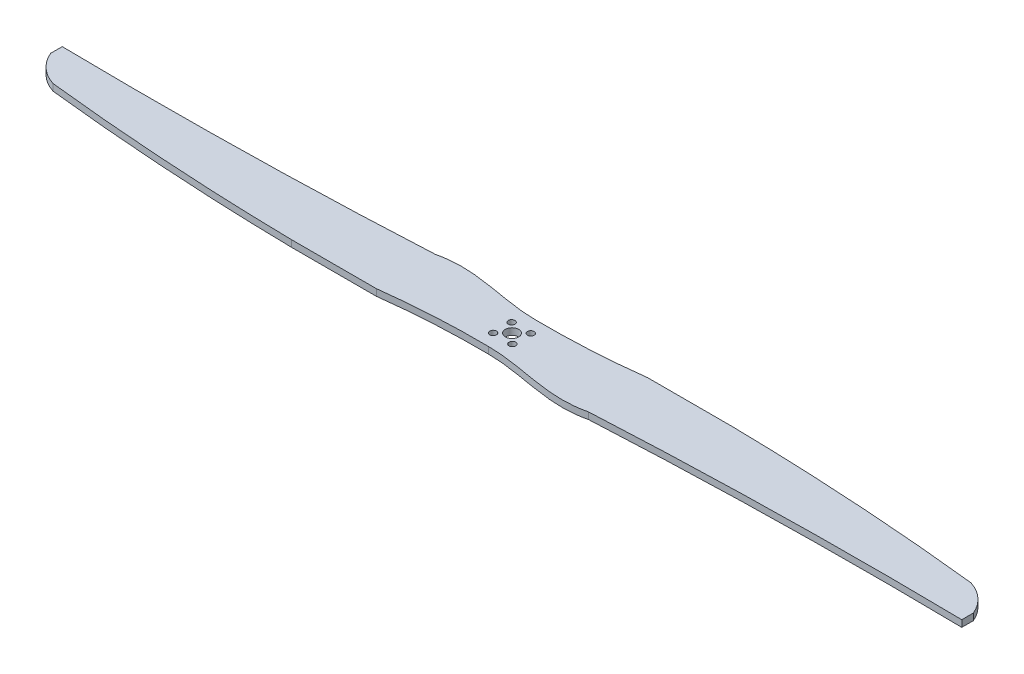
ISO-10303-21;
HEADER;
FILE_DESCRIPTION(('STEP AP214'),'2;1');
FILE_NAME('part.step','',(''),(''),'','','');
FILE_SCHEMA(('AUTOMOTIVE_DESIGN { 1 0 10303 214 1 1 1 1 }'));
ENDSEC;
DATA;
#1=APPLICATION_CONTEXT('core data for automotive mechanical design processes');
#2=APPLICATION_PROTOCOL_DEFINITION('international standard','automotive_design',2000,#1);
#3=PRODUCT_CONTEXT('',#1,'mechanical');
#4=PRODUCT('Part','Part','',(#3));
#5=PRODUCT_RELATED_PRODUCT_CATEGORY('part','',(#4));
#6=PRODUCT_DEFINITION_FORMATION('','',#4);
#7=PRODUCT_DEFINITION_CONTEXT('part definition',#1,'design');
#8=PRODUCT_DEFINITION('design','',#6,#7);
#9=PRODUCT_DEFINITION_SHAPE('','',#8);
#10=(LENGTH_UNIT() NAMED_UNIT(*) SI_UNIT(.MILLI.,.METRE.));
#11=(NAMED_UNIT(*) PLANE_ANGLE_UNIT() SI_UNIT($,.RADIAN.));
#12=(NAMED_UNIT(*) SI_UNIT($,.STERADIAN.) SOLID_ANGLE_UNIT());
#13=UNCERTAINTY_MEASURE_WITH_UNIT(LENGTH_MEASURE(1.E-05),#10,'distance_accuracy_value','');
#14=(GEOMETRIC_REPRESENTATION_CONTEXT(3) GLOBAL_UNCERTAINTY_ASSIGNED_CONTEXT((#13)) GLOBAL_UNIT_ASSIGNED_CONTEXT((#10,
#11,#12)) REPRESENTATION_CONTEXT('',''));
#15=CARTESIAN_POINT('',(0.,0.,0.));
#16=DIRECTION('',(0.,0.,1.));
#17=DIRECTION('',(1.,0.,0.));
#18=AXIS2_PLACEMENT_3D('',#15,#16,#17);
#19=CARTESIAN_POINT('',(335.,-2.5,-10.));
#20=CARTESIAN_POINT('',(207.750610825478,-2.5,-23.9960746393306));
#21=CARTESIAN_POINT('',(80.,-2.5,-22.));
#22=B_SPLINE_CURVE_WITH_KNOTS('',2,(#19,#20,#21),.UNSPECIFIED.,.F.,.F.,(3,3),(0.,1.),.UNSPECIFIED.);
#23=DIRECTION('',(0.,1.,0.));
#24=VECTOR('',#23,1.);
#25=SURFACE_OF_LINEAR_EXTRUSION('',#22,#24);
#26=DIRECTION('',(0.,1.,0.));
#27=VECTOR('',#26,1.);
#28=CARTESIAN_POINT('',(143.749999999999,-2.5,-22.));
#29=LINE('',#28,#27);
#30=CARTESIAN_POINT('',(143.749999999999,-2.5,-22.));
#31=VERTEX_POINT('',#30);
#32=CARTESIAN_POINT('',(143.749999999999,2.5,-22.));
#33=VERTEX_POINT('',#32);
#34=EDGE_CURVE('E40',#31,#33,#29,.T.);
#35=ORIENTED_EDGE('',*,*,#34,.T.);
#36=CARTESIAN_POINT('',(335.,2.5,-10.));
#37=CARTESIAN_POINT('',(207.750610825478,2.5,-23.9960746393306));
#38=CARTESIAN_POINT('',(80.,2.5,-22.));
#39=B_SPLINE_CURVE_WITH_KNOTS('',2,(#36,#37,#38),.UNSPECIFIED.,.F.,.F.,(3,3),(0.,1.),.UNSPECIFIED.);
#40=CARTESIAN_POINT('',(335.,2.5,-10.));
#41=VERTEX_POINT('',#40);
#42=EDGE_CURVE('E283',#41,#33,#39,.T.);
#43=ORIENTED_EDGE('',*,*,#42,.F.);
#44=DIRECTION('',(0.,1.,0.));
#45=VECTOR('',#44,1.);
#46=CARTESIAN_POINT('',(335.,-2.5,-10.));
#47=LINE('',#46,#45);
#48=CARTESIAN_POINT('',(335.,-2.5,-10.));
#49=VERTEX_POINT('',#48);
#50=EDGE_CURVE('E11',#49,#41,#47,.T.);
#51=ORIENTED_EDGE('',*,*,#50,.F.);
#52=EDGE_CURVE('E284',#49,#31,#22,.T.);
#53=ORIENTED_EDGE('',*,*,#52,.T.);
#54=EDGE_LOOP('',(#35,#43,#51,#53));
#55=FACE_BOUND('',#54,.T.);
#56=ADVANCED_FACE('F36',(#55),#25,.T.);
#57=CARTESIAN_POINT('',(325.075714008156,-2.5,21.5947488763719));
#58=DIRECTION('',(0.,1.,0.));
#59=DIRECTION('',(0.,0.,1.));
#60=AXIS2_PLACEMENT_3D('',#57,#58,#59);
#61=CYLINDRICAL_SURFACE('',#60,33.1167572236309);
#62=ORIENTED_EDGE('',*,*,#50,.T.);
#63=CARTESIAN_POINT('',(325.075714008156,2.5,21.5947488763719));
#64=DIRECTION('',(0.,1.,0.));
#65=DIRECTION('',(0.,0.,1.));
#66=AXIS2_PLACEMENT_3D('',#63,#64,#65);
#67=CIRCLE('',#66,33.1167572236309);
#68=CARTESIAN_POINT('',(355.6,2.5,8.75000000000002));
#69=VERTEX_POINT('',#68);
#70=EDGE_CURVE('E292',#69,#41,#67,.T.);
#71=ORIENTED_EDGE('',*,*,#70,.F.);
#72=DIRECTION('',(0.,1.,0.));
#73=VECTOR('',#72,1.);
#74=CARTESIAN_POINT('',(355.6,-2.5,8.75000000000002));
#75=LINE('',#74,#73);
#76=CARTESIAN_POINT('',(355.6,-2.5,8.75000000000002));
#77=VERTEX_POINT('',#76);
#78=EDGE_CURVE('E45',#77,#69,#75,.T.);
#79=ORIENTED_EDGE('',*,*,#78,.F.);
#80=CARTESIAN_POINT('',(325.075714008156,-2.5,21.5947488763719));
#81=DIRECTION('',(0.,1.,0.));
#82=DIRECTION('',(0.,0.,1.));
#83=AXIS2_PLACEMENT_3D('',#80,#81,#82);
#84=CIRCLE('',#83,33.1167572236309);
#85=EDGE_CURVE('E259',#77,#49,#84,.T.);
#86=ORIENTED_EDGE('',*,*,#85,.T.);
#87=EDGE_LOOP('',(#62,#71,#79,#86));
#88=FACE_BOUND('',#87,.T.);
#89=ADVANCED_FACE('F224',(#88),#61,.T.);
#90=CARTESIAN_POINT('',(355.6,-2.5,0.));
#91=DIRECTION('',(-1.,0.,0.));
#92=DIRECTION('',(0.,0.,1.));
#93=AXIS2_PLACEMENT_3D('',#90,#91,#92);
#94=PLANE('',#93);
#95=ORIENTED_EDGE('',*,*,#78,.T.);
#96=DIRECTION('',(0.,0.,1.));
#97=VECTOR('',#96,1.);
#98=CARTESIAN_POINT('',(355.6,2.5,0.));
#99=LINE('',#98,#97);
#100=CARTESIAN_POINT('',(355.6,2.5,17.5));
#101=VERTEX_POINT('',#100);
#102=EDGE_CURVE('E319',#69,#101,#99,.T.);
#103=ORIENTED_EDGE('',*,*,#102,.T.);
#104=DIRECTION('',(0.,1.,0.));
#105=VECTOR('',#104,1.);
#106=CARTESIAN_POINT('',(355.6,-2.5,17.5));
#107=LINE('',#106,#105);
#108=CARTESIAN_POINT('',(355.6,-2.5,17.5));
#109=VERTEX_POINT('',#108);
#110=EDGE_CURVE('E268',#109,#101,#107,.T.);
#111=ORIENTED_EDGE('',*,*,#110,.F.);
#112=DIRECTION('',(0.,0.,1.));
#113=VECTOR('',#112,1.);
#114=CARTESIAN_POINT('',(355.6,-2.5,0.));
#115=LINE('',#114,#113);
#116=EDGE_CURVE('E257',#77,#109,#115,.T.);
#117=ORIENTED_EDGE('',*,*,#116,.F.);
#118=EDGE_LOOP('',(#95,#103,#111,#117));
#119=FACE_BOUND('',#118,.T.);
#120=ADVANCED_FACE('F227',(#119),#94,.F.);
#121=CARTESIAN_POINT('',(289.29232916411,-2.5,3960.65718352576));
#122=DIRECTION('',(0.,1.,0.));
#123=DIRECTION('',(0.,0.,1.));
#124=AXIS2_PLACEMENT_3D('',#121,#122,#123);
#125=CYLINDRICAL_SURFACE('',#124,3943.71465514462);
#126=ORIENTED_EDGE('',*,*,#110,.T.);
#127=CARTESIAN_POINT('',(289.29232916411,2.5,3960.65718352576));
#128=DIRECTION('',(0.,1.,0.));
#129=DIRECTION('',(0.,0.,1.));
#130=AXIS2_PLACEMENT_3D('',#127,#128,#129);
#131=CIRCLE('',#130,3943.71465514462);
#132=CARTESIAN_POINT('',(79.9999999999992,2.5,22.5000000000004));
#133=VERTEX_POINT('',#132);
#134=EDGE_CURVE('E313',#133,#101,#131,.F.);
#135=ORIENTED_EDGE('',*,*,#134,.F.);
#136=DIRECTION('',(0.,1.,0.));
#137=VECTOR('',#136,1.);
#138=CARTESIAN_POINT('',(79.9999999999992,-2.5,22.5000000000004));
#139=LINE('',#138,#137);
#140=CARTESIAN_POINT('',(79.9999999999992,-2.5,22.5000000000004));
#141=VERTEX_POINT('',#140);
#142=EDGE_CURVE('E270',#141,#133,#139,.T.);
#143=ORIENTED_EDGE('',*,*,#142,.F.);
#144=CARTESIAN_POINT('',(289.29232916411,-2.5,3960.65718352576));
#145=DIRECTION('',(0.,1.,0.));
#146=DIRECTION('',(0.,0.,1.));
#147=AXIS2_PLACEMENT_3D('',#144,#145,#146);
#148=CIRCLE('',#147,3943.71465514462);
#149=EDGE_CURVE('E249',#141,#109,#148,.F.);
#150=ORIENTED_EDGE('',*,*,#149,.T.);
#151=EDGE_LOOP('',(#126,#135,#143,#150));
#152=FACE_BOUND('',#151,.T.);
#153=ADVANCED_FACE('F230',(#152),#125,.F.);
#154=CARTESIAN_POINT('',(0.,-2.5,17.5));
#155=CARTESIAN_POINT('',(26.9441187382483,-2.5,17.5325819704456));
#156=CARTESIAN_POINT('',(52.6196628030616,-2.5,29.0659508435102));
#157=CARTESIAN_POINT('',(80.,-2.5,22.5));
#158=B_SPLINE_CURVE_WITH_KNOTS('',3,(#154,#155,#156,#157),.UNSPECIFIED.,.F.,.F.,(4,4),(0.,1.),.UNSPECIFIED.);
#159=DIRECTION('',(0.,1.,0.));
#160=VECTOR('',#159,1.);
#161=SURFACE_OF_LINEAR_EXTRUSION('',#158,#160);
#162=ORIENTED_EDGE('',*,*,#142,.T.);
#163=CARTESIAN_POINT('',(0.,2.5,17.5));
#164=CARTESIAN_POINT('',(26.9441187382483,2.5,17.5325819704456));
#165=CARTESIAN_POINT('',(52.6196628030616,2.5,29.0659508435102));
#166=CARTESIAN_POINT('',(80.,2.5,22.5));
#167=B_SPLINE_CURVE_WITH_KNOTS('',3,(#163,#164,#165,#166),.UNSPECIFIED.,.F.,.F.,(4,4),(0.,1.),.UNSPECIFIED.);
#168=CARTESIAN_POINT('',(0.,2.5,17.5));
#169=VERTEX_POINT('',#168);
#170=EDGE_CURVE('E308',#169,#133,#167,.T.);
#171=ORIENTED_EDGE('',*,*,#170,.F.);
#172=DIRECTION('',(0.,1.,0.));
#173=VECTOR('',#172,1.);
#174=CARTESIAN_POINT('',(0.,-2.5,17.5));
#175=LINE('',#174,#173);
#176=CARTESIAN_POINT('',(0.,-2.5,17.5));
#177=VERTEX_POINT('',#176);
#178=EDGE_CURVE('E272',#177,#169,#175,.T.);
#179=ORIENTED_EDGE('',*,*,#178,.F.);
#180=EDGE_CURVE('E242',#177,#141,#158,.T.);
#181=ORIENTED_EDGE('',*,*,#180,.T.);
#182=EDGE_LOOP('',(#162,#171,#179,#181));
#183=FACE_BOUND('',#182,.T.);
#184=ADVANCED_FACE('F234',(#183),#161,.T.);
#185=CARTESIAN_POINT('',(0.,-2.5,0.));
#186=DIRECTION('',(0.,1.,0.));
#187=DIRECTION('',(0.,0.,1.));
#188=AXIS2_PLACEMENT_3D('',#185,#186,#187);
#189=CYLINDRICAL_SURFACE('',#188,5.);
#190=CARTESIAN_POINT('',(0.,2.5,0.));
#191=DIRECTION('',(0.,1.,0.));
#192=DIRECTION('',(0.,0.,1.));
#193=AXIS2_PLACEMENT_3D('',#190,#191,#192);
#194=CIRCLE('',#193,5.);
#195=CARTESIAN_POINT('',(0.,2.5,5.));
#196=VERTEX_POINT('',#195);
#197=EDGE_CURVE('E305',#196,#196,#194,.T.);
#198=ORIENTED_EDGE('',*,*,#197,.T.);
#199=EDGE_LOOP('',(#198));
#200=FACE_BOUND('',#199,.T.);
#201=CARTESIAN_POINT('',(0.,-2.5,0.));
#202=DIRECTION('',(0.,1.,0.));
#203=DIRECTION('',(0.,0.,1.));
#204=AXIS2_PLACEMENT_3D('',#201,#202,#203);
#205=CIRCLE('',#204,5.);
#206=CARTESIAN_POINT('',(0.,-2.5,5.));
#207=VERTEX_POINT('',#206);
#208=EDGE_CURVE('E250',#207,#207,#205,.T.);
#209=ORIENTED_EDGE('',*,*,#208,.F.);
#210=EDGE_LOOP('',(#209));
#211=FACE_BOUND('',#210,.T.);
#212=ADVANCED_FACE('F239',(#200,#211),#189,.F.);
#213=CARTESIAN_POINT('',(7.20964400706171,-2.5,-602.689662096679));
#214=DIRECTION('',(0.,1.,0.));
#215=DIRECTION('',(0.,0.,1.));
#216=AXIS2_PLACEMENT_3D('',#213,#214,#215);
#217=CYLINDRICAL_SURFACE('',#216,585.234072480007);
#218=DIRECTION('',(0.,1.,0.));
#219=VECTOR('',#218,1.);
#220=CARTESIAN_POINT('',(0.,-2.5,-17.5));
#221=LINE('',#220,#219);
#222=CARTESIAN_POINT('',(0.,-2.5,-17.5));
#223=VERTEX_POINT('',#222);
#224=CARTESIAN_POINT('',(0.,2.5,-17.5));
#225=VERTEX_POINT('',#224);
#226=EDGE_CURVE('E275',#223,#225,#221,.T.);
#227=ORIENTED_EDGE('',*,*,#226,.T.);
#228=CARTESIAN_POINT('',(7.20964400706171,2.5,-602.689662096679));
#229=DIRECTION('',(0.,1.,0.));
#230=DIRECTION('',(0.,0.,1.));
#231=AXIS2_PLACEMENT_3D('',#228,#229,#230);
#232=CIRCLE('',#231,585.234072480007);
#233=CARTESIAN_POINT('',(80.,2.5,-22.));
#234=VERTEX_POINT('',#233);
#235=EDGE_CURVE('E288',#234,#225,#232,.F.);
#236=ORIENTED_EDGE('',*,*,#235,.F.);
#237=DIRECTION('',(0.,1.,0.));
#238=VECTOR('',#237,1.);
#239=CARTESIAN_POINT('',(80.,-2.5,-22.));
#240=LINE('',#239,#238);
#241=CARTESIAN_POINT('',(80.,-2.5,-22.));
#242=VERTEX_POINT('',#241);
#243=EDGE_CURVE('E277',#242,#234,#240,.T.);
#244=ORIENTED_EDGE('',*,*,#243,.F.);
#245=CARTESIAN_POINT('',(7.20964400706171,-2.5,-602.689662096679));
#246=DIRECTION('',(0.,1.,0.));
#247=DIRECTION('',(0.,0.,1.));
#248=AXIS2_PLACEMENT_3D('',#245,#246,#247);
#249=CIRCLE('',#248,585.234072480007);
#250=EDGE_CURVE('E336',#242,#223,#249,.F.);
#251=ORIENTED_EDGE('',*,*,#250,.T.);
#252=EDGE_LOOP('',(#227,#236,#244,#251));
#253=FACE_BOUND('',#252,.T.);
#254=ADVANCED_FACE('F222',(#253),#217,.F.);
#255=CARTESIAN_POINT('',(7.20964400706171,-2.5,6.92972101108257));
#256=DIRECTION('',(0.,1.,0.));
#257=DIRECTION('',(0.,0.,1.));
#258=AXIS2_PLACEMENT_3D('',#255,#256,#257);
#259=CYLINDRICAL_SURFACE('',#258,2.5);
#260=CARTESIAN_POINT('',(7.20964400706171,-2.5,6.92972101108257));
#261=DIRECTION('',(0.,1.,0.));
#262=DIRECTION('',(0.,0.,1.));
#263=AXIS2_PLACEMENT_3D('',#260,#261,#262);
#264=CIRCLE('',#263,2.5);
#265=CARTESIAN_POINT('',(7.20964400706171,-2.5,9.42972101108257));
#266=VERTEX_POINT('',#265);
#267=EDGE_CURVE('E261',#266,#266,#264,.T.);
#268=ORIENTED_EDGE('',*,*,#267,.F.);
#269=EDGE_LOOP('',(#268));
#270=FACE_BOUND('',#269,.T.);
#271=CARTESIAN_POINT('',(7.20964400706171,2.5,6.92972101108257));
#272=DIRECTION('',(0.,1.,0.));
#273=DIRECTION('',(0.,0.,1.));
#274=AXIS2_PLACEMENT_3D('',#271,#272,#273);
#275=CIRCLE('',#274,2.5);
#276=CARTESIAN_POINT('',(7.20964400706171,2.5,9.42972101108257));
#277=VERTEX_POINT('',#276);
#278=EDGE_CURVE('E323',#277,#277,#275,.T.);
#279=ORIENTED_EDGE('',*,*,#278,.T.);
#280=EDGE_LOOP('',(#279));
#281=FACE_BOUND('',#280,.T.);
#282=ADVANCED_FACE('F219',(#270,#281),#259,.F.);
#283=CARTESIAN_POINT('',(0.,-2.5,-22.));
#284=DIRECTION('',(0.,0.,-1.));
#285=DIRECTION('',(-1.,0.,0.));
#286=AXIS2_PLACEMENT_3D('',#283,#284,#285);
#287=PLANE('',#286);
#288=ORIENTED_EDGE('',*,*,#243,.T.);
#289=DIRECTION('',(-1.,0.,0.));
#290=VECTOR('',#289,1.);
#291=CARTESIAN_POINT('',(0.,2.5,-22.));
#292=LINE('',#291,#290);
#293=EDGE_CURVE('E286',#33,#234,#292,.T.);
#294=ORIENTED_EDGE('',*,*,#293,.F.);
#295=ORIENTED_EDGE('',*,*,#34,.F.);
#296=DIRECTION('',(-1.,0.,0.));
#297=VECTOR('',#296,1.);
#298=CARTESIAN_POINT('',(0.,-2.5,-22.));
#299=LINE('',#298,#297);
#300=EDGE_CURVE('E332',#31,#242,#299,.T.);
#301=ORIENTED_EDGE('',*,*,#300,.T.);
#302=EDGE_LOOP('',(#288,#294,#295,#301));
#303=FACE_BOUND('',#302,.T.);
#304=ADVANCED_FACE('F217',(#303),#287,.T.);
#305=CARTESIAN_POINT('',(7.20964400706171,-2.5,-6.92972101108257));
#306=DIRECTION('',(0.,1.,0.));
#307=DIRECTION('',(0.,0.,1.));
#308=AXIS2_PLACEMENT_3D('',#305,#306,#307);
#309=CYLINDRICAL_SURFACE('',#308,2.5);
#310=CARTESIAN_POINT('',(7.20964400706171,-2.5,-6.92972101108257));
#311=DIRECTION('',(0.,1.,0.));
#312=DIRECTION('',(0.,0.,1.));
#313=AXIS2_PLACEMENT_3D('',#310,#311,#312);
#314=CIRCLE('',#313,2.5);
#315=CARTESIAN_POINT('',(7.20964400706171,-2.5,-4.42972101108257));
#316=VERTEX_POINT('',#315);
#317=EDGE_CURVE('E264',#316,#316,#314,.T.);
#318=ORIENTED_EDGE('',*,*,#317,.F.);
#319=EDGE_LOOP('',(#318));
#320=FACE_BOUND('',#319,.T.);
#321=CARTESIAN_POINT('',(7.20964400706171,2.5,-6.92972101108257));
#322=DIRECTION('',(0.,1.,0.));
#323=DIRECTION('',(0.,0.,1.));
#324=AXIS2_PLACEMENT_3D('',#321,#322,#323);
#325=CIRCLE('',#324,2.5);
#326=CARTESIAN_POINT('',(7.20964400706171,2.5,-4.42972101108257));
#327=VERTEX_POINT('',#326);
#328=EDGE_CURVE('E326',#327,#327,#325,.T.);
#329=ORIENTED_EDGE('',*,*,#328,.T.);
#330=EDGE_LOOP('',(#329));
#331=FACE_BOUND('',#330,.T.);
#332=ADVANCED_FACE('F213',(#320,#331),#309,.F.);
#333=CARTESIAN_POINT('',(0.,-2.5,0.));
#334=DIRECTION('',(0.,1.,0.));
#335=DIRECTION('',(0.,0.,1.));
#336=AXIS2_PLACEMENT_3D('',#333,#334,#335);
#337=PLANE('',#336);
#338=CARTESIAN_POINT('',(0.,-2.5,-17.5));
#339=CARTESIAN_POINT('',(-26.9441187382483,-2.5,-17.5325819704456));
#340=CARTESIAN_POINT('',(-52.6196628030616,-2.5,-29.0659508435102));
#341=CARTESIAN_POINT('',(-80.,-2.5,-22.5));
#342=B_SPLINE_CURVE_WITH_KNOTS('',3,(#338,#339,#340,#341),.UNSPECIFIED.,.F.,.F.,(4,4),(0.,1.),.UNSPECIFIED.);
#343=CARTESIAN_POINT('',(-79.9999999999992,-2.5,-22.5000000000004));
#344=VERTEX_POINT('',#343);
#345=EDGE_CURVE('E491',#223,#344,#342,.T.);
#346=ORIENTED_EDGE('',*,*,#345,.F.);
#347=ORIENTED_EDGE('',*,*,#250,.F.);
#348=ORIENTED_EDGE('',*,*,#300,.F.);
#349=ORIENTED_EDGE('',*,*,#52,.F.);
#350=ORIENTED_EDGE('',*,*,#85,.F.);
#351=ORIENTED_EDGE('',*,*,#116,.T.);
#352=ORIENTED_EDGE('',*,*,#149,.F.);
#353=ORIENTED_EDGE('',*,*,#180,.F.);
#354=CARTESIAN_POINT('',(-7.20964400706171,-2.5,602.689662096679));
#355=DIRECTION('',(0.,1.,0.));
#356=DIRECTION('',(0.,0.,-1.));
#357=AXIS2_PLACEMENT_3D('',#354,#355,#356);
#358=CIRCLE('',#357,585.234072480007);
#359=CARTESIAN_POINT('',(-80.,-2.5,22.));
#360=VERTEX_POINT('',#359);
#361=EDGE_CURVE('E498',#360,#177,#358,.F.);
#362=ORIENTED_EDGE('',*,*,#361,.F.);
#363=DIRECTION('',(1.,0.,0.));
#364=VECTOR('',#363,1.);
#365=CARTESIAN_POINT('',(0.,-2.5,22.));
#366=LINE('',#365,#364);
#367=CARTESIAN_POINT('',(-143.749999999999,-2.5,22.));
#368=VERTEX_POINT('',#367);
#369=EDGE_CURVE('E197',#368,#360,#366,.T.);
#370=ORIENTED_EDGE('',*,*,#369,.F.);
#371=CARTESIAN_POINT('',(-335.,-2.5,10.));
#372=CARTESIAN_POINT('',(-207.750610825478,-2.5,23.9960746393306));
#373=CARTESIAN_POINT('',(-80.,-2.5,22.));
#374=B_SPLINE_CURVE_WITH_KNOTS('',2,(#371,#372,#373),.UNSPECIFIED.,.F.,.F.,(3,3),(0.,1.),.UNSPECIFIED.);
#375=CARTESIAN_POINT('',(-335.,-2.5,10.));
#376=VERTEX_POINT('',#375);
#377=EDGE_CURVE('E144',#376,#368,#374,.T.);
#378=ORIENTED_EDGE('',*,*,#377,.F.);
#379=CARTESIAN_POINT('',(-325.075714008156,-2.5,-21.5947488763719));
#380=DIRECTION('',(0.,1.,0.));
#381=DIRECTION('',(0.,0.,-1.));
#382=AXIS2_PLACEMENT_3D('',#379,#380,#381);
#383=CIRCLE('',#382,33.1167572236309);
#384=CARTESIAN_POINT('',(-355.6,-2.5,-8.75000000000002));
#385=VERTEX_POINT('',#384);
#386=EDGE_CURVE('E506',#385,#376,#383,.T.);
#387=ORIENTED_EDGE('',*,*,#386,.F.);
#388=DIRECTION('',(0.,0.,-1.));
#389=VECTOR('',#388,1.);
#390=CARTESIAN_POINT('',(-355.6,-2.5,0.));
#391=LINE('',#390,#389);
#392=CARTESIAN_POINT('',(-355.6,-2.5,-17.5));
#393=VERTEX_POINT('',#392);
#394=EDGE_CURVE('E504',#385,#393,#391,.T.);
#395=ORIENTED_EDGE('',*,*,#394,.T.);
#396=CARTESIAN_POINT('',(-289.29232916411,-2.5,-3960.65718352576));
#397=DIRECTION('',(0.,1.,0.));
#398=DIRECTION('',(0.,0.,-1.));
#399=AXIS2_PLACEMENT_3D('',#396,#397,#398);
#400=CIRCLE('',#399,3943.71465514462);
#401=EDGE_CURVE('E497',#344,#393,#400,.F.);
#402=ORIENTED_EDGE('',*,*,#401,.F.);
#403=EDGE_LOOP('',(#346,#347,#348,#349,#350,#351,#352,#353,#362,#370,#378,#387,#395,#402));
#404=FACE_BOUND('',#403,.T.);
#405=ORIENTED_EDGE('',*,*,#208,.T.);
#406=EDGE_LOOP('',(#405));
#407=FACE_BOUND('',#406,.T.);
#408=ORIENTED_EDGE('',*,*,#267,.T.);
#409=EDGE_LOOP('',(#408));
#410=FACE_BOUND('',#409,.T.);
#411=ORIENTED_EDGE('',*,*,#317,.T.);
#412=EDGE_LOOP('',(#411));
#413=FACE_BOUND('',#412,.T.);
#414=CARTESIAN_POINT('',(-7.20964400706171,-2.5,-6.92972101108257));
#415=DIRECTION('',(0.,1.,0.));
#416=DIRECTION('',(0.,0.,-1.));
#417=AXIS2_PLACEMENT_3D('',#414,#415,#416);
#418=CIRCLE('',#417,2.5);
#419=CARTESIAN_POINT('',(-7.20964400706171,-2.5,-9.42972101108257));
#420=VERTEX_POINT('',#419);
#421=EDGE_CURVE('E509',#420,#420,#418,.T.);
#422=ORIENTED_EDGE('',*,*,#421,.T.);
#423=EDGE_LOOP('',(#422));
#424=FACE_BOUND('',#423,.T.);
#425=CARTESIAN_POINT('',(-7.20964400706171,-2.5,6.92972101108257));
#426=DIRECTION('',(0.,1.,0.));
#427=DIRECTION('',(0.,0.,-1.));
#428=AXIS2_PLACEMENT_3D('',#425,#426,#427);
#429=CIRCLE('',#428,2.5);
#430=CARTESIAN_POINT('',(-7.20964400706171,-2.5,4.42972101108257));
#431=VERTEX_POINT('',#430);
#432=EDGE_CURVE('E149',#431,#431,#429,.T.);
#433=ORIENTED_EDGE('',*,*,#432,.T.);
#434=EDGE_LOOP('',(#433));
#435=FACE_BOUND('',#434,.T.);
#436=ADVANCED_FACE('F210',(#404,#407,#410,#413,#424,#435),#337,.F.);
#437=CARTESIAN_POINT('',(0.,2.5,0.));
#438=DIRECTION('',(0.,1.,0.));
#439=DIRECTION('',(0.,0.,1.));
#440=AXIS2_PLACEMENT_3D('',#437,#438,#439);
#441=PLANE('',#440);
#442=ORIENTED_EDGE('',*,*,#235,.T.);
#443=CARTESIAN_POINT('',(0.,2.5,-17.5));
#444=CARTESIAN_POINT('',(-26.9441187382483,2.5,-17.5325819704456));
#445=CARTESIAN_POINT('',(-52.6196628030616,2.5,-29.0659508435102));
#446=CARTESIAN_POINT('',(-80.,2.5,-22.5));
#447=B_SPLINE_CURVE_WITH_KNOTS('',3,(#443,#444,#445,#446),.UNSPECIFIED.,.F.,.F.,(4,4),(0.,1.),.UNSPECIFIED.);
#448=CARTESIAN_POINT('',(-79.9999999999992,2.5,-22.5000000000004));
#449=VERTEX_POINT('',#448);
#450=EDGE_CURVE('E172',#225,#449,#447,.T.);
#451=ORIENTED_EDGE('',*,*,#450,.T.);
#452=CARTESIAN_POINT('',(-289.29232916411,2.5,-3960.65718352576));
#453=DIRECTION('',(0.,1.,0.));
#454=DIRECTION('',(0.,0.,-1.));
#455=AXIS2_PLACEMENT_3D('',#452,#453,#454);
#456=CIRCLE('',#455,3943.71465514462);
#457=CARTESIAN_POINT('',(-355.6,2.5,-17.5));
#458=VERTEX_POINT('',#457);
#459=EDGE_CURVE('E177',#449,#458,#456,.F.);
#460=ORIENTED_EDGE('',*,*,#459,.T.);
#461=DIRECTION('',(0.,0.,-1.));
#462=VECTOR('',#461,1.);
#463=CARTESIAN_POINT('',(-355.6,2.5,0.));
#464=LINE('',#463,#462);
#465=CARTESIAN_POINT('',(-355.6,2.5,-8.75000000000002));
#466=VERTEX_POINT('',#465);
#467=EDGE_CURVE('E183',#466,#458,#464,.T.);
#468=ORIENTED_EDGE('',*,*,#467,.F.);
#469=CARTESIAN_POINT('',(-325.075714008156,2.5,-21.5947488763719));
#470=DIRECTION('',(0.,1.,0.));
#471=DIRECTION('',(0.,0.,-1.));
#472=AXIS2_PLACEMENT_3D('',#469,#470,#471);
#473=CIRCLE('',#472,33.1167572236309);
#474=CARTESIAN_POINT('',(-335.,2.5,10.));
#475=VERTEX_POINT('',#474);
#476=EDGE_CURVE('E163',#466,#475,#473,.T.);
#477=ORIENTED_EDGE('',*,*,#476,.T.);
#478=CARTESIAN_POINT('',(-335.,2.5,10.));
#479=CARTESIAN_POINT('',(-207.750610825478,2.5,23.9960746393306));
#480=CARTESIAN_POINT('',(-80.,2.5,22.));
#481=B_SPLINE_CURVE_WITH_KNOTS('',2,(#478,#479,#480),.UNSPECIFIED.,.F.,.F.,(3,3),(0.,1.),.UNSPECIFIED.);
#482=CARTESIAN_POINT('',(-143.749999999999,2.5,22.));
#483=VERTEX_POINT('',#482);
#484=EDGE_CURVE('E142',#475,#483,#481,.T.);
#485=ORIENTED_EDGE('',*,*,#484,.T.);
#486=DIRECTION('',(1.,0.,0.));
#487=VECTOR('',#486,1.);
#488=CARTESIAN_POINT('',(0.,2.5,22.));
#489=LINE('',#488,#487);
#490=CARTESIAN_POINT('',(-80.,2.5,22.));
#491=VERTEX_POINT('',#490);
#492=EDGE_CURVE('E152',#483,#491,#489,.T.);
#493=ORIENTED_EDGE('',*,*,#492,.T.);
#494=CARTESIAN_POINT('',(-7.20964400706171,2.5,602.689662096679));
#495=DIRECTION('',(0.,1.,0.));
#496=DIRECTION('',(0.,0.,-1.));
#497=AXIS2_PLACEMENT_3D('',#494,#495,#496);
#498=CIRCLE('',#497,585.234072480007);
#499=EDGE_CURVE('E156',#491,#169,#498,.F.);
#500=ORIENTED_EDGE('',*,*,#499,.T.);
#501=ORIENTED_EDGE('',*,*,#170,.T.);
#502=ORIENTED_EDGE('',*,*,#134,.T.);
#503=ORIENTED_EDGE('',*,*,#102,.F.);
#504=ORIENTED_EDGE('',*,*,#70,.T.);
#505=ORIENTED_EDGE('',*,*,#42,.T.);
#506=ORIENTED_EDGE('',*,*,#293,.T.);
#507=EDGE_LOOP('',(#442,#451,#460,#468,#477,#485,#493,#500,#501,#502,#503,#504,#505,#506));
#508=FACE_BOUND('',#507,.T.);
#509=ORIENTED_EDGE('',*,*,#197,.F.);
#510=EDGE_LOOP('',(#509));
#511=FACE_BOUND('',#510,.T.);
#512=ORIENTED_EDGE('',*,*,#278,.F.);
#513=EDGE_LOOP('',(#512));
#514=FACE_BOUND('',#513,.T.);
#515=ORIENTED_EDGE('',*,*,#328,.F.);
#516=EDGE_LOOP('',(#515));
#517=FACE_BOUND('',#516,.T.);
#518=CARTESIAN_POINT('',(-7.20964400706171,2.5,-6.92972101108257));
#519=DIRECTION('',(0.,1.,0.));
#520=DIRECTION('',(0.,0.,-1.));
#521=AXIS2_PLACEMENT_3D('',#518,#519,#520);
#522=CIRCLE('',#521,2.5);
#523=CARTESIAN_POINT('',(-7.20964400706171,2.5,-9.42972101108257));
#524=VERTEX_POINT('',#523);
#525=EDGE_CURVE('E187',#524,#524,#522,.T.);
#526=ORIENTED_EDGE('',*,*,#525,.F.);
#527=EDGE_LOOP('',(#526));
#528=FACE_BOUND('',#527,.T.);
#529=CARTESIAN_POINT('',(-7.20964400706171,2.5,6.92972101108257));
#530=DIRECTION('',(0.,1.,0.));
#531=DIRECTION('',(0.,0.,-1.));
#532=AXIS2_PLACEMENT_3D('',#529,#530,#531);
#533=CIRCLE('',#532,2.5);
#534=CARTESIAN_POINT('',(-7.20964400706171,2.5,4.42972101108257));
#535=VERTEX_POINT('',#534);
#536=EDGE_CURVE('E190',#535,#535,#533,.T.);
#537=ORIENTED_EDGE('',*,*,#536,.F.);
#538=EDGE_LOOP('',(#537));
#539=FACE_BOUND('',#538,.T.);
#540=ADVANCED_FACE('F159',(#508,#511,#514,#517,#528,#539),#441,.T.);
#541=DIRECTION('',(0.,1.,0.));
#542=VECTOR('',#541,1.);
#543=SURFACE_OF_LINEAR_EXTRUSION('',#374,#542);
#544=DIRECTION('',(0.,1.,0.));
#545=VECTOR('',#544,1.);
#546=CARTESIAN_POINT('',(-143.749999999999,-2.5,22.));
#547=LINE('',#546,#545);
#548=EDGE_CURVE('E138',#368,#483,#547,.T.);
#549=ORIENTED_EDGE('',*,*,#548,.T.);
#550=ORIENTED_EDGE('',*,*,#484,.F.);
#551=DIRECTION('',(0.,1.,0.));
#552=VECTOR('',#551,1.);
#553=CARTESIAN_POINT('',(-335.,-2.5,10.));
#554=LINE('',#553,#552);
#555=EDGE_CURVE('E293',#376,#475,#554,.T.);
#556=ORIENTED_EDGE('',*,*,#555,.F.);
#557=ORIENTED_EDGE('',*,*,#377,.T.);
#558=EDGE_LOOP('',(#549,#550,#556,#557));
#559=FACE_BOUND('',#558,.T.);
#560=ADVANCED_FACE('F140',(#559),#543,.T.);
#561=CARTESIAN_POINT('',(-325.075714008156,-2.5,-21.5947488763719));
#562=DIRECTION('',(0.,1.,0.));
#563=DIRECTION('',(0.,0.,1.));
#564=AXIS2_PLACEMENT_3D('',#561,#562,#563);
#565=CYLINDRICAL_SURFACE('',#564,33.1167572236309);
#566=ORIENTED_EDGE('',*,*,#555,.T.);
#567=ORIENTED_EDGE('',*,*,#476,.F.);
#568=DIRECTION('',(0.,1.,0.));
#569=VECTOR('',#568,1.);
#570=CARTESIAN_POINT('',(-355.6,-2.5,-8.75000000000002));
#571=LINE('',#570,#569);
#572=EDGE_CURVE('E295',#385,#466,#571,.T.);
#573=ORIENTED_EDGE('',*,*,#572,.F.);
#574=ORIENTED_EDGE('',*,*,#386,.T.);
#575=EDGE_LOOP('',(#566,#567,#573,#574));
#576=FACE_BOUND('',#575,.T.);
#577=ADVANCED_FACE('F206',(#576),#565,.T.);
#578=CARTESIAN_POINT('',(-355.6,-2.5,0.));
#579=DIRECTION('',(1.,0.,0.));
#580=DIRECTION('',(0.,0.,-1.));
#581=AXIS2_PLACEMENT_3D('',#578,#579,#580);
#582=PLANE('',#581);
#583=ORIENTED_EDGE('',*,*,#572,.T.);
#584=ORIENTED_EDGE('',*,*,#467,.T.);
#585=DIRECTION('',(0.,1.,0.));
#586=VECTOR('',#585,1.);
#587=CARTESIAN_POINT('',(-355.6,-2.5,-17.5));
#588=LINE('',#587,#586);
#589=EDGE_CURVE('E515',#393,#458,#588,.T.);
#590=ORIENTED_EDGE('',*,*,#589,.F.);
#591=ORIENTED_EDGE('',*,*,#394,.F.);
#592=EDGE_LOOP('',(#583,#584,#590,#591));
#593=FACE_BOUND('',#592,.T.);
#594=ADVANCED_FACE('F418',(#593),#582,.F.);
#595=CARTESIAN_POINT('',(-289.29232916411,-2.5,-3960.65718352576));
#596=DIRECTION('',(0.,1.,0.));
#597=DIRECTION('',(0.,0.,1.));
#598=AXIS2_PLACEMENT_3D('',#595,#596,#597);
#599=CYLINDRICAL_SURFACE('',#598,3943.71465514462);
#600=ORIENTED_EDGE('',*,*,#589,.T.);
#601=ORIENTED_EDGE('',*,*,#459,.F.);
#602=DIRECTION('',(0.,1.,0.));
#603=VECTOR('',#602,1.);
#604=CARTESIAN_POINT('',(-79.9999999999992,-2.5,-22.5000000000004));
#605=LINE('',#604,#603);
#606=EDGE_CURVE('E517',#344,#449,#605,.T.);
#607=ORIENTED_EDGE('',*,*,#606,.F.);
#608=ORIENTED_EDGE('',*,*,#401,.T.);
#609=EDGE_LOOP('',(#600,#601,#607,#608));
#610=FACE_BOUND('',#609,.T.);
#611=ADVANCED_FACE('F428',(#610),#599,.F.);
#612=DIRECTION('',(0.,1.,0.));
#613=VECTOR('',#612,1.);
#614=SURFACE_OF_LINEAR_EXTRUSION('',#342,#613);
#615=ORIENTED_EDGE('',*,*,#606,.T.);
#616=ORIENTED_EDGE('',*,*,#450,.F.);
#617=ORIENTED_EDGE('',*,*,#226,.F.);
#618=ORIENTED_EDGE('',*,*,#345,.T.);
#619=EDGE_LOOP('',(#615,#616,#617,#618));
#620=FACE_BOUND('',#619,.T.);
#621=ADVANCED_FACE('F438',(#620),#614,.T.);
#622=CARTESIAN_POINT('',(-7.20964400706171,-2.5,602.689662096679));
#623=DIRECTION('',(0.,1.,0.));
#624=DIRECTION('',(0.,0.,1.));
#625=AXIS2_PLACEMENT_3D('',#622,#623,#624);
#626=CYLINDRICAL_SURFACE('',#625,585.234072480007);
#627=ORIENTED_EDGE('',*,*,#178,.T.);
#628=ORIENTED_EDGE('',*,*,#499,.F.);
#629=DIRECTION('',(0.,1.,0.));
#630=VECTOR('',#629,1.);
#631=CARTESIAN_POINT('',(-80.,-2.5,22.));
#632=LINE('',#631,#630);
#633=EDGE_CURVE('E148',#360,#491,#632,.T.);
#634=ORIENTED_EDGE('',*,*,#633,.F.);
#635=ORIENTED_EDGE('',*,*,#361,.T.);
#636=EDGE_LOOP('',(#627,#628,#634,#635));
#637=FACE_BOUND('',#636,.T.);
#638=ADVANCED_FACE('F448',(#637),#626,.F.);
#639=CARTESIAN_POINT('',(-7.20964400706171,-2.5,-6.92972101108257));
#640=DIRECTION('',(0.,1.,0.));
#641=DIRECTION('',(0.,0.,1.));
#642=AXIS2_PLACEMENT_3D('',#639,#640,#641);
#643=CYLINDRICAL_SURFACE('',#642,2.5);
#644=ORIENTED_EDGE('',*,*,#421,.F.);
#645=EDGE_LOOP('',(#644));
#646=FACE_BOUND('',#645,.T.);
#647=ORIENTED_EDGE('',*,*,#525,.T.);
#648=EDGE_LOOP('',(#647));
#649=FACE_BOUND('',#648,.T.);
#650=ADVANCED_FACE('F458',(#646,#649),#643,.F.);
#651=CARTESIAN_POINT('',(0.,-2.5,22.));
#652=DIRECTION('',(0.,0.,1.));
#653=DIRECTION('',(1.,0.,0.));
#654=AXIS2_PLACEMENT_3D('',#651,#652,#653);
#655=PLANE('',#654);
#656=ORIENTED_EDGE('',*,*,#633,.T.);
#657=ORIENTED_EDGE('',*,*,#492,.F.);
#658=ORIENTED_EDGE('',*,*,#548,.F.);
#659=ORIENTED_EDGE('',*,*,#369,.T.);
#660=EDGE_LOOP('',(#656,#657,#658,#659));
#661=FACE_BOUND('',#660,.T.);
#662=ADVANCED_FACE('F153',(#661),#655,.T.);
#663=CARTESIAN_POINT('',(-7.20964400706171,-2.5,6.92972101108257));
#664=DIRECTION('',(0.,1.,0.));
#665=DIRECTION('',(0.,0.,1.));
#666=AXIS2_PLACEMENT_3D('',#663,#664,#665);
#667=CYLINDRICAL_SURFACE('',#666,2.5);
#668=ORIENTED_EDGE('',*,*,#432,.F.);
#669=EDGE_LOOP('',(#668));
#670=FACE_BOUND('',#669,.T.);
#671=ORIENTED_EDGE('',*,*,#536,.T.);
#672=EDGE_LOOP('',(#671));
#673=FACE_BOUND('',#672,.T.);
#674=ADVANCED_FACE('F476',(#670,#673),#667,.F.);
#675=CLOSED_SHELL('',(#56,#89,#120,#153,#184,#212,#254,#282,#304,#332,#436,#540,#560,#577,#594,
#611,#621,#638,#650,#662,#674));
#676=MANIFOLD_SOLID_BREP('B2',#675);
#677=ADVANCED_BREP_SHAPE_REPRESENTATION('',(#18,#676),#14);
#678=SHAPE_DEFINITION_REPRESENTATION(#9,#677);
ENDSEC;
END-ISO-10303-21;
